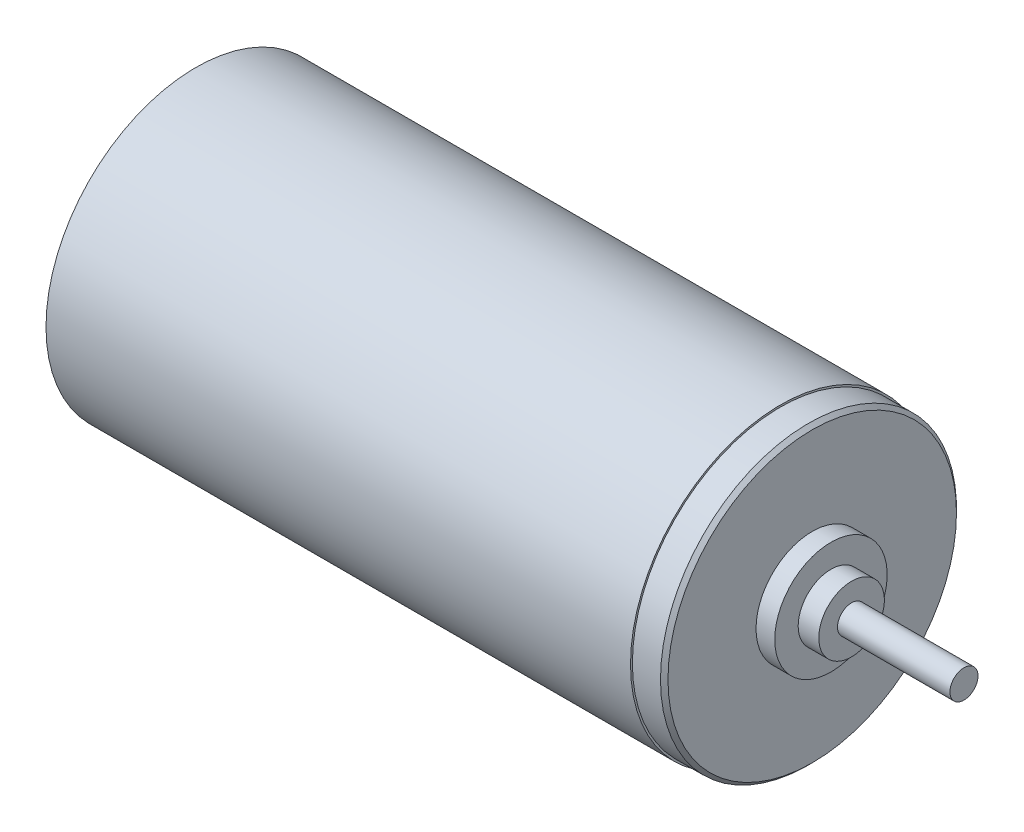
ISO-10303-21;
HEADER;
FILE_DESCRIPTION(('STEP AP214'),'2;1');
FILE_NAME('part.step','',(''),(''),'','','');
FILE_SCHEMA(('AUTOMOTIVE_DESIGN { 1 0 10303 214 1 1 1 1 }'));
ENDSEC;
DATA;
#1=APPLICATION_CONTEXT('core data for automotive mechanical design processes');
#2=APPLICATION_PROTOCOL_DEFINITION('international standard','automotive_design',2000,#1);
#3=PRODUCT_CONTEXT('',#1,'mechanical');
#4=PRODUCT('Part','Part','',(#3));
#5=PRODUCT_RELATED_PRODUCT_CATEGORY('part','',(#4));
#6=PRODUCT_DEFINITION_FORMATION('','',#4);
#7=PRODUCT_DEFINITION_CONTEXT('part definition',#1,'design');
#8=PRODUCT_DEFINITION('design','',#6,#7);
#9=PRODUCT_DEFINITION_SHAPE('','',#8);
#10=(LENGTH_UNIT() NAMED_UNIT(*) SI_UNIT(.MILLI.,.METRE.));
#11=(NAMED_UNIT(*) PLANE_ANGLE_UNIT() SI_UNIT($,.RADIAN.));
#12=(NAMED_UNIT(*) SI_UNIT($,.STERADIAN.) SOLID_ANGLE_UNIT());
#13=UNCERTAINTY_MEASURE_WITH_UNIT(LENGTH_MEASURE(1.E-05),#10,'distance_accuracy_value','');
#14=(GEOMETRIC_REPRESENTATION_CONTEXT(3) GLOBAL_UNCERTAINTY_ASSIGNED_CONTEXT((#13)) GLOBAL_UNIT_ASSIGNED_CONTEXT((#10,
#11,#12)) REPRESENTATION_CONTEXT('',''));
#15=CARTESIAN_POINT('',(0.,0.,0.));
#16=DIRECTION('',(0.,0.,1.));
#17=DIRECTION('',(1.,0.,0.));
#18=AXIS2_PLACEMENT_3D('',#15,#16,#17);
#19=CARTESIAN_POINT('',(-53.0314416538363,0.,0.));
#20=DIRECTION('',(1.,0.,0.));
#21=DIRECTION('',(0.,0.,-1.));
#22=AXIS2_PLACEMENT_3D('',#19,#20,#21);
#23=PLANE('',#22);
#24=CARTESIAN_POINT('',(-53.0314416538363,0.,0.));
#25=DIRECTION('',(-1.,0.,0.));
#26=DIRECTION('',(0.,0.,1.));
#27=AXIS2_PLACEMENT_3D('',#24,#25,#26);
#28=CIRCLE('',#27,8.);
#29=CARTESIAN_POINT('',(-53.0314416538363,0.,8.));
#30=VERTEX_POINT('',#29);
#31=EDGE_CURVE('E43',#30,#30,#28,.T.);
#32=ORIENTED_EDGE('',*,*,#31,.T.);
#33=EDGE_LOOP('',(#32));
#34=FACE_BOUND('',#33,.T.);
#35=ADVANCED_FACE('F32',(#34),#23,.F.);
#36=CARTESIAN_POINT('',(-60.2613492750834,0.,0.));
#37=DIRECTION('',(-1.,0.,0.));
#38=DIRECTION('',(0.,0.,1.));
#39=AXIS2_PLACEMENT_3D('',#36,#37,#38);
#40=CYLINDRICAL_SURFACE('',#39,8.);
#41=ORIENTED_EDGE('',*,*,#31,.F.);
#42=EDGE_LOOP('',(#41));
#43=FACE_BOUND('',#42,.T.);
#44=CARTESIAN_POINT('',(-21.8314416538363,0.,0.));
#45=DIRECTION('',(-1.,0.,0.));
#46=DIRECTION('',(0.,0.,1.));
#47=AXIS2_PLACEMENT_3D('',#44,#45,#46);
#48=CIRCLE('',#47,8.);
#49=CARTESIAN_POINT('',(-21.8314416538363,0.,8.));
#50=VERTEX_POINT('',#49);
#51=EDGE_CURVE('E47',#50,#50,#48,.T.);
#52=ORIENTED_EDGE('',*,*,#51,.T.);
#53=EDGE_LOOP('',(#52));
#54=FACE_BOUND('',#53,.T.);
#55=ADVANCED_FACE('F88',(#43,#54),#40,.T.);
#56=CARTESIAN_POINT('',(-21.8314416538363,8.,0.));
#57=DIRECTION('',(-1.,0.,0.));
#58=DIRECTION('',(0.,0.,1.));
#59=AXIS2_PLACEMENT_3D('',#56,#57,#58);
#60=PLANE('',#59);
#61=ORIENTED_EDGE('',*,*,#51,.F.);
#62=EDGE_LOOP('',(#61));
#63=FACE_BOUND('',#62,.T.);
#64=CARTESIAN_POINT('',(-21.8314416538363,0.,0.));
#65=DIRECTION('',(-1.,0.,0.));
#66=DIRECTION('',(0.,0.,1.));
#67=AXIS2_PLACEMENT_3D('',#64,#65,#66);
#68=CIRCLE('',#67,7.9);
#69=CARTESIAN_POINT('',(-21.8314416538363,0.,7.9));
#70=VERTEX_POINT('',#69);
#71=EDGE_CURVE('E52',#70,#70,#68,.T.);
#72=ORIENTED_EDGE('',*,*,#71,.T.);
#73=EDGE_LOOP('',(#72));
#74=FACE_BOUND('',#73,.T.);
#75=ADVANCED_FACE('F93',(#63,#74),#60,.F.);
#76=CARTESIAN_POINT('',(-60.2613492750834,0.,0.));
#77=DIRECTION('',(-1.,0.,0.));
#78=DIRECTION('',(0.,0.,1.));
#79=AXIS2_PLACEMENT_3D('',#76,#77,#78);
#80=CYLINDRICAL_SURFACE('',#79,7.9);
#81=CARTESIAN_POINT('',(-20.3314416538363,0.,0.));
#82=DIRECTION('',(-1.,0.,0.));
#83=DIRECTION('',(0.,0.,1.));
#84=AXIS2_PLACEMENT_3D('',#81,#82,#83);
#85=CIRCLE('',#84,7.9);
#86=CARTESIAN_POINT('',(-20.3314416538363,0.,7.9));
#87=VERTEX_POINT('',#86);
#88=EDGE_CURVE('E39',#87,#87,#85,.T.);
#89=ORIENTED_EDGE('',*,*,#88,.T.);
#90=EDGE_LOOP('',(#89));
#91=FACE_BOUND('',#90,.T.);
#92=ORIENTED_EDGE('',*,*,#71,.F.);
#93=EDGE_LOOP('',(#92));
#94=FACE_BOUND('',#93,.T.);
#95=ADVANCED_FACE('F99',(#91,#94),#80,.T.);
#96=CARTESIAN_POINT('',(-20.1314416538363,7.9,0.));
#97=DIRECTION('',(-1.,0.,0.));
#98=DIRECTION('',(0.,0.,1.));
#99=AXIS2_PLACEMENT_3D('',#96,#97,#98);
#100=PLANE('',#99);
#101=CARTESIAN_POINT('',(-20.1314416538363,0.,0.));
#102=DIRECTION('',(-1.,0.,0.));
#103=DIRECTION('',(0.,0.,1.));
#104=AXIS2_PLACEMENT_3D('',#101,#102,#103);
#105=CIRCLE('',#104,7.70000000000001);
#106=CARTESIAN_POINT('',(-20.1314416538363,0.,7.70000000000001));
#107=VERTEX_POINT('',#106);
#108=EDGE_CURVE('E10',#107,#107,#105,.F.);
#109=ORIENTED_EDGE('',*,*,#108,.T.);
#110=EDGE_LOOP('',(#109));
#111=FACE_BOUND('',#110,.T.);
#112=CARTESIAN_POINT('',(-20.1314416538363,0.,0.));
#113=DIRECTION('',(-1.,0.,0.));
#114=DIRECTION('',(0.,0.,1.));
#115=AXIS2_PLACEMENT_3D('',#112,#113,#114);
#116=CIRCLE('',#115,3.);
#117=CARTESIAN_POINT('',(-20.1314416538363,0.,3.));
#118=VERTEX_POINT('',#117);
#119=EDGE_CURVE('E55',#118,#118,#116,.T.);
#120=ORIENTED_EDGE('',*,*,#119,.T.);
#121=EDGE_LOOP('',(#120));
#122=FACE_BOUND('',#121,.T.);
#123=ADVANCED_FACE('F103',(#111,#122),#100,.F.);
#124=CARTESIAN_POINT('',(-60.2613492750834,0.,0.));
#125=DIRECTION('',(-1.,0.,0.));
#126=DIRECTION('',(0.,0.,1.));
#127=AXIS2_PLACEMENT_3D('',#124,#125,#126);
#128=CYLINDRICAL_SURFACE('',#127,3.);
#129=ORIENTED_EDGE('',*,*,#119,.F.);
#130=EDGE_LOOP('',(#129));
#131=FACE_BOUND('',#130,.T.);
#132=CARTESIAN_POINT('',(-19.1314416538363,0.,0.));
#133=DIRECTION('',(-1.,0.,0.));
#134=DIRECTION('',(0.,0.,1.));
#135=AXIS2_PLACEMENT_3D('',#132,#133,#134);
#136=CIRCLE('',#135,3.);
#137=CARTESIAN_POINT('',(-19.1314416538363,0.,3.));
#138=VERTEX_POINT('',#137);
#139=EDGE_CURVE('E58',#138,#138,#136,.T.);
#140=ORIENTED_EDGE('',*,*,#139,.T.);
#141=EDGE_LOOP('',(#140));
#142=FACE_BOUND('',#141,.T.);
#143=ADVANCED_FACE('F106',(#131,#142),#128,.T.);
#144=CARTESIAN_POINT('',(-19.1314416538363,3.,0.));
#145=DIRECTION('',(-1.,0.,0.));
#146=DIRECTION('',(0.,0.,1.));
#147=AXIS2_PLACEMENT_3D('',#144,#145,#146);
#148=PLANE('',#147);
#149=ORIENTED_EDGE('',*,*,#139,.F.);
#150=EDGE_LOOP('',(#149));
#151=FACE_BOUND('',#150,.T.);
#152=CARTESIAN_POINT('',(-19.1314416538363,0.,0.));
#153=DIRECTION('',(-1.,0.,0.));
#154=DIRECTION('',(0.,0.,1.));
#155=AXIS2_PLACEMENT_3D('',#152,#153,#154);
#156=CIRCLE('',#155,1.75);
#157=CARTESIAN_POINT('',(-19.1314416538363,0.,1.75));
#158=VERTEX_POINT('',#157);
#159=EDGE_CURVE('E61',#158,#158,#156,.T.);
#160=ORIENTED_EDGE('',*,*,#159,.T.);
#161=EDGE_LOOP('',(#160));
#162=FACE_BOUND('',#161,.T.);
#163=ADVANCED_FACE('F109',(#151,#162),#148,.F.);
#164=CARTESIAN_POINT('',(-60.2613492750834,0.,0.));
#165=DIRECTION('',(-1.,0.,0.));
#166=DIRECTION('',(0.,0.,1.));
#167=AXIS2_PLACEMENT_3D('',#164,#165,#166);
#168=CYLINDRICAL_SURFACE('',#167,1.75);
#169=ORIENTED_EDGE('',*,*,#159,.F.);
#170=EDGE_LOOP('',(#169));
#171=FACE_BOUND('',#170,.T.);
#172=CARTESIAN_POINT('',(-18.0314416538363,0.,0.));
#173=DIRECTION('',(-1.,0.,0.));
#174=DIRECTION('',(0.,0.,1.));
#175=AXIS2_PLACEMENT_3D('',#172,#173,#174);
#176=CIRCLE('',#175,1.75);
#177=CARTESIAN_POINT('',(-18.0314416538363,0.,1.75));
#178=VERTEX_POINT('',#177);
#179=EDGE_CURVE('E64',#178,#178,#176,.T.);
#180=ORIENTED_EDGE('',*,*,#179,.T.);
#181=EDGE_LOOP('',(#180));
#182=FACE_BOUND('',#181,.T.);
#183=ADVANCED_FACE('F113',(#171,#182),#168,.T.);
#184=CARTESIAN_POINT('',(-18.0314416538363,1.75,0.));
#185=DIRECTION('',(-1.,0.,0.));
#186=DIRECTION('',(0.,0.,1.));
#187=AXIS2_PLACEMENT_3D('',#184,#185,#186);
#188=PLANE('',#187);
#189=ORIENTED_EDGE('',*,*,#179,.F.);
#190=EDGE_LOOP('',(#189));
#191=FACE_BOUND('',#190,.T.);
#192=CARTESIAN_POINT('',(-18.0314416538363,0.,0.));
#193=DIRECTION('',(-1.,0.,0.));
#194=DIRECTION('',(0.,0.,1.));
#195=AXIS2_PLACEMENT_3D('',#192,#193,#194);
#196=CIRCLE('',#195,0.75);
#197=CARTESIAN_POINT('',(-18.0314416538363,0.,0.75));
#198=VERTEX_POINT('',#197);
#199=EDGE_CURVE('E67',#198,#198,#196,.T.);
#200=ORIENTED_EDGE('',*,*,#199,.T.);
#201=EDGE_LOOP('',(#200));
#202=FACE_BOUND('',#201,.T.);
#203=ADVANCED_FACE('F84',(#191,#202),#188,.F.);
#204=CARTESIAN_POINT('',(-60.2613492750834,0.,0.));
#205=DIRECTION('',(-1.,0.,0.));
#206=DIRECTION('',(0.,0.,1.));
#207=AXIS2_PLACEMENT_3D('',#204,#205,#206);
#208=CYLINDRICAL_SURFACE('',#207,0.75);
#209=ORIENTED_EDGE('',*,*,#199,.F.);
#210=EDGE_LOOP('',(#209));
#211=FACE_BOUND('',#210,.T.);
#212=CARTESIAN_POINT('',(-12.0314416538363,0.,0.));
#213=DIRECTION('',(-1.,0.,0.));
#214=DIRECTION('',(0.,0.,1.));
#215=AXIS2_PLACEMENT_3D('',#212,#213,#214);
#216=CIRCLE('',#215,0.75);
#217=CARTESIAN_POINT('',(-12.0314416538363,0.,0.75));
#218=VERTEX_POINT('',#217);
#219=EDGE_CURVE('E70',#218,#218,#216,.T.);
#220=ORIENTED_EDGE('',*,*,#219,.T.);
#221=EDGE_LOOP('',(#220));
#222=FACE_BOUND('',#221,.T.);
#223=ADVANCED_FACE('F74',(#211,#222),#208,.T.);
#224=CARTESIAN_POINT('',(-12.0314416538363,0.75,0.));
#225=DIRECTION('',(-1.,0.,0.));
#226=DIRECTION('',(0.,0.,1.));
#227=AXIS2_PLACEMENT_3D('',#224,#225,#226);
#228=PLANE('',#227);
#229=ORIENTED_EDGE('',*,*,#219,.F.);
#230=EDGE_LOOP('',(#229));
#231=FACE_BOUND('',#230,.T.);
#232=ADVANCED_FACE('F76',(#231),#228,.F.);
#233=CARTESIAN_POINT('',(-20.3314416538363,0.,0.));
#234=DIRECTION('',(-1.,0.,0.));
#235=DIRECTION('',(0.,0.,1.));
#236=AXIS2_PLACEMENT_3D('',#233,#234,#235);
#237=CONICAL_SURFACE('',#236,7.9,0.78539816339744);
#238=ORIENTED_EDGE('',*,*,#108,.F.);
#239=EDGE_LOOP('',(#238));
#240=FACE_BOUND('',#239,.T.);
#241=ORIENTED_EDGE('',*,*,#88,.F.);
#242=EDGE_LOOP('',(#241));
#243=FACE_BOUND('',#242,.T.);
#244=ADVANCED_FACE('F34',(#240,#243),#237,.T.);
#245=CLOSED_SHELL('',(#35,#55,#75,#95,#123,#143,#163,#183,#203,#223,#232,#244));
#246=MANIFOLD_SOLID_BREP('B2',#245);
#247=ADVANCED_BREP_SHAPE_REPRESENTATION('',(#18,#246),#14);
#248=SHAPE_DEFINITION_REPRESENTATION(#9,#247);
ENDSEC;
END-ISO-10303-21;
